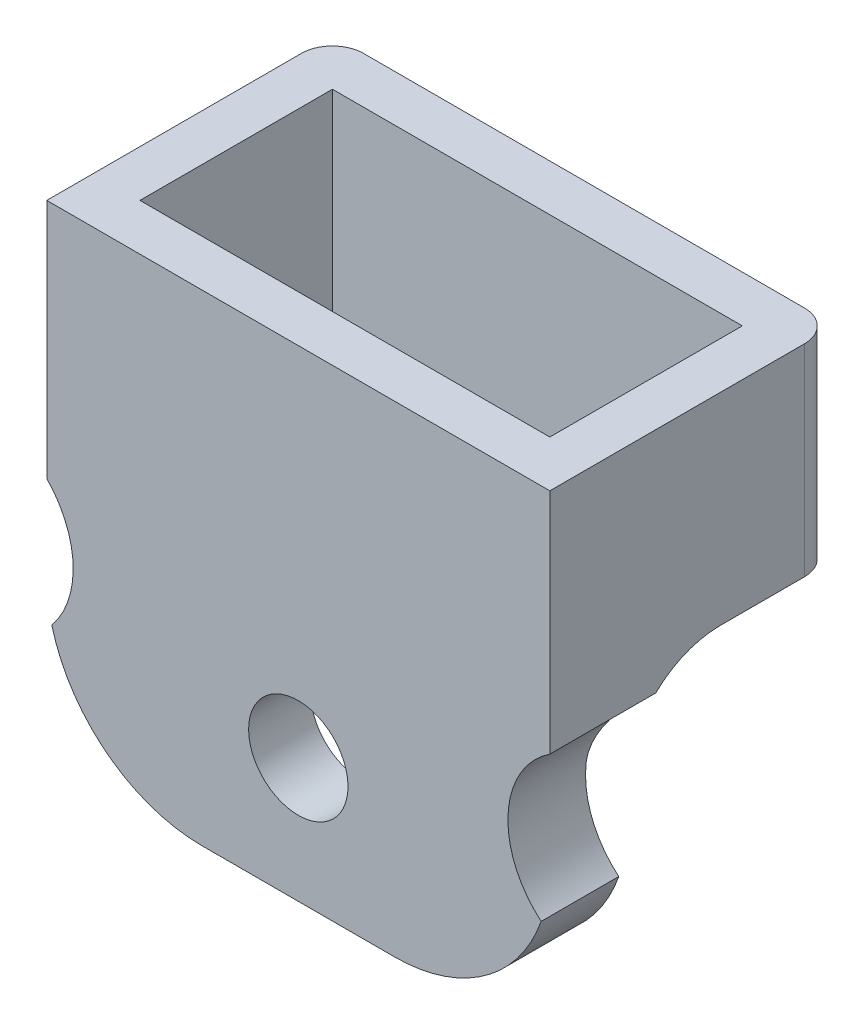
ISO-10303-21;
HEADER;
FILE_DESCRIPTION(('STEP AP214'),'2;1');
FILE_NAME('part.step','',(''),(''),'','','');
FILE_SCHEMA(('AUTOMOTIVE_DESIGN { 1 0 10303 214 1 1 1 1 }'));
ENDSEC;
DATA;
#1=APPLICATION_CONTEXT('core data for automotive mechanical design processes');
#2=APPLICATION_PROTOCOL_DEFINITION('international standard','automotive_design',2000,#1);
#3=PRODUCT_CONTEXT('',#1,'mechanical');
#4=PRODUCT('Part','Part','',(#3));
#5=PRODUCT_RELATED_PRODUCT_CATEGORY('part','',(#4));
#6=PRODUCT_DEFINITION_FORMATION('','',#4);
#7=PRODUCT_DEFINITION_CONTEXT('part definition',#1,'design');
#8=PRODUCT_DEFINITION('design','',#6,#7);
#9=PRODUCT_DEFINITION_SHAPE('','',#8);
#10=(LENGTH_UNIT() NAMED_UNIT(*) SI_UNIT(.MILLI.,.METRE.));
#11=(NAMED_UNIT(*) PLANE_ANGLE_UNIT() SI_UNIT($,.RADIAN.));
#12=(NAMED_UNIT(*) SI_UNIT($,.STERADIAN.) SOLID_ANGLE_UNIT());
#13=UNCERTAINTY_MEASURE_WITH_UNIT(LENGTH_MEASURE(1.E-05),#10,'distance_accuracy_value','');
#14=(GEOMETRIC_REPRESENTATION_CONTEXT(3) GLOBAL_UNCERTAINTY_ASSIGNED_CONTEXT((#13)) GLOBAL_UNIT_ASSIGNED_CONTEXT((#10,
#11,#12)) REPRESENTATION_CONTEXT('',''));
#15=CARTESIAN_POINT('',(0.,0.,0.));
#16=DIRECTION('',(0.,0.,1.));
#17=DIRECTION('',(1.,0.,0.));
#18=AXIS2_PLACEMENT_3D('',#15,#16,#17);
#19=CARTESIAN_POINT('',(6.6,-5.,6.0254833995939));
#20=DIRECTION('',(0.,0.,-1.));
#21=DIRECTION('',(-1.,0.,0.));
#22=AXIS2_PLACEMENT_3D('',#19,#20,#21);
#23=CYLINDRICAL_SURFACE('',#22,1.6);
#24=CARTESIAN_POINT('',(6.6,-5.,1.5));
#25=DIRECTION('',(0.,0.,-1.));
#26=DIRECTION('',(-1.,0.,0.));
#27=AXIS2_PLACEMENT_3D('',#24,#25,#26);
#28=CIRCLE('',#27,1.6);
#29=CARTESIAN_POINT('',(5.,-5.,1.5));
#30=VERTEX_POINT('',#29);
#31=EDGE_CURVE('E383',#30,#30,#28,.F.);
#32=ORIENTED_EDGE('',*,*,#31,.T.);
#33=EDGE_LOOP('',(#32));
#34=FACE_BOUND('',#33,.T.);
#35=CARTESIAN_POINT('',(6.6,-5.,-0.5));
#36=DIRECTION('',(0.,0.,-1.));
#37=DIRECTION('',(-1.,0.,0.));
#38=AXIS2_PLACEMENT_3D('',#35,#36,#37);
#39=CIRCLE('',#38,1.6);
#40=CARTESIAN_POINT('',(5.,-5.,-0.500000000000001));
#41=VERTEX_POINT('',#40);
#42=EDGE_CURVE('E37',#41,#41,#39,.F.);
#43=ORIENTED_EDGE('',*,*,#42,.F.);
#44=EDGE_LOOP('',(#43));
#45=FACE_BOUND('',#44,.T.);
#46=ADVANCED_FACE('F32',(#34,#45),#23,.F.);
#47=CARTESIAN_POINT('',(0.,6.5,0.));
#48=DIRECTION('',(0.,-1.,0.));
#49=DIRECTION('',(0.,0.,-1.));
#50=AXIS2_PLACEMENT_3D('',#47,#48,#49);
#51=PLANE('',#50);
#52=DIRECTION('',(0.,0.,-1.));
#53=VECTOR('',#52,1.);
#54=CARTESIAN_POINT('',(14.7,6.5,1.5));
#55=LINE('',#54,#53);
#56=CARTESIAN_POINT('',(14.7,6.5,1.5));
#57=VERTEX_POINT('',#56);
#58=CARTESIAN_POINT('',(14.7,6.5,-6.7));
#59=VERTEX_POINT('',#58);
#60=EDGE_CURVE('E417',#57,#59,#55,.T.);
#61=ORIENTED_EDGE('',*,*,#60,.T.);
#62=CARTESIAN_POINT('',(13.7,6.5,-6.7));
#63=DIRECTION('',(0.,-1.,0.));
#64=DIRECTION('',(0.,0.,-1.));
#65=AXIS2_PLACEMENT_3D('',#62,#63,#64);
#66=CIRCLE('',#65,1.);
#67=CARTESIAN_POINT('',(13.7,6.5,-7.7));
#68=VERTEX_POINT('',#67);
#69=EDGE_CURVE('E361',#59,#68,#66,.F.);
#70=ORIENTED_EDGE('',*,*,#69,.T.);
#71=DIRECTION('',(-1.,0.,0.));
#72=VECTOR('',#71,1.);
#73=CARTESIAN_POINT('',(-1.5,6.5,-7.7));
#74=LINE('',#73,#72);
#75=CARTESIAN_POINT('',(-0.5,6.5,-7.7));
#76=VERTEX_POINT('',#75);
#77=EDGE_CURVE('E347',#68,#76,#74,.T.);
#78=ORIENTED_EDGE('',*,*,#77,.T.);
#79=CARTESIAN_POINT('',(-0.5,6.5,-6.7));
#80=DIRECTION('',(0.,-1.,0.));
#81=DIRECTION('',(0.,0.,-1.));
#82=AXIS2_PLACEMENT_3D('',#79,#80,#81);
#83=CIRCLE('',#82,1.);
#84=CARTESIAN_POINT('',(-1.5,6.5,-6.7));
#85=VERTEX_POINT('',#84);
#86=EDGE_CURVE('E359',#76,#85,#83,.F.);
#87=ORIENTED_EDGE('',*,*,#86,.T.);
#88=DIRECTION('',(0.,0.,1.));
#89=VECTOR('',#88,1.);
#90=CARTESIAN_POINT('',(-1.5,6.5,1.5));
#91=LINE('',#90,#89);
#92=CARTESIAN_POINT('',(-1.5,6.5,1.5));
#93=VERTEX_POINT('',#92);
#94=EDGE_CURVE('E338',#85,#93,#91,.T.);
#95=ORIENTED_EDGE('',*,*,#94,.T.);
#96=DIRECTION('',(1.,0.,0.));
#97=VECTOR('',#96,1.);
#98=CARTESIAN_POINT('',(-1.5,6.5,1.5));
#99=LINE('',#98,#97);
#100=EDGE_CURVE('E415',#93,#57,#99,.T.);
#101=ORIENTED_EDGE('',*,*,#100,.T.);
#102=EDGE_LOOP('',(#61,#70,#78,#87,#95,#101));
#103=FACE_BOUND('',#102,.T.);
#104=DIRECTION('',(0.,0.,1.));
#105=VECTOR('',#104,1.);
#106=CARTESIAN_POINT('',(0.,6.5,0.));
#107=LINE('',#106,#105);
#108=CARTESIAN_POINT('',(0.,6.5,-6.2));
#109=VERTEX_POINT('',#108);
#110=CARTESIAN_POINT('',(0.,6.5,0.));
#111=VERTEX_POINT('',#110);
#112=EDGE_CURVE('E384',#109,#111,#107,.T.);
#113=ORIENTED_EDGE('',*,*,#112,.F.);
#114=DIRECTION('',(-1.,0.,0.));
#115=VECTOR('',#114,1.);
#116=CARTESIAN_POINT('',(0.,6.5,-6.2));
#117=LINE('',#116,#115);
#118=CARTESIAN_POINT('',(13.2,6.5,-6.2));
#119=VERTEX_POINT('',#118);
#120=EDGE_CURVE('E392',#119,#109,#117,.T.);
#121=ORIENTED_EDGE('',*,*,#120,.F.);
#122=DIRECTION('',(0.,0.,-1.));
#123=VECTOR('',#122,1.);
#124=CARTESIAN_POINT('',(13.2,6.5,0.));
#125=LINE('',#124,#123);
#126=CARTESIAN_POINT('',(13.2,6.5,0.));
#127=VERTEX_POINT('',#126);
#128=EDGE_CURVE('E389',#127,#119,#125,.T.);
#129=ORIENTED_EDGE('',*,*,#128,.F.);
#130=DIRECTION('',(1.,0.,0.));
#131=VECTOR('',#130,1.);
#132=CARTESIAN_POINT('',(0.,6.5,0.));
#133=LINE('',#132,#131);
#134=EDGE_CURVE('E386',#111,#127,#133,.T.);
#135=ORIENTED_EDGE('',*,*,#134,.F.);
#136=EDGE_LOOP('',(#113,#121,#129,#135));
#137=FACE_BOUND('',#136,.T.);
#138=ADVANCED_FACE('F247',(#103,#137),#51,.F.);
#139=CARTESIAN_POINT('',(0.,0.,0.));
#140=DIRECTION('',(0.,-1.,0.));
#141=DIRECTION('',(0.,0.,-1.));
#142=AXIS2_PLACEMENT_3D('',#139,#140,#141);
#143=PLANE('',#142);
#144=DIRECTION('',(0.,0.,-1.));
#145=VECTOR('',#144,1.);
#146=CARTESIAN_POINT('',(14.7,0.,1.5));
#147=LINE('',#146,#145);
#148=CARTESIAN_POINT('',(14.7,0.,-4.));
#149=VERTEX_POINT('',#148);
#150=CARTESIAN_POINT('',(14.7,0.,-6.7));
#151=VERTEX_POINT('',#150);
#152=EDGE_CURVE('E327',#149,#151,#147,.T.);
#153=ORIENTED_EDGE('',*,*,#152,.F.);
#154=DIRECTION('',(1.,0.,0.));
#155=VECTOR('',#154,1.);
#156=CARTESIAN_POINT('',(0.,0.,-4.));
#157=LINE('',#156,#155);
#158=CARTESIAN_POINT('',(13.2,0.,-4.));
#159=VERTEX_POINT('',#158);
#160=EDGE_CURVE('E218',#149,#159,#157,.F.);
#161=ORIENTED_EDGE('',*,*,#160,.T.);
#162=DIRECTION('',(0.,0.,-1.));
#163=VECTOR('',#162,1.);
#164=CARTESIAN_POINT('',(13.2,0.,0.));
#165=LINE('',#164,#163);
#166=CARTESIAN_POINT('',(13.2,0.,-6.2));
#167=VERTEX_POINT('',#166);
#168=EDGE_CURVE('E399',#159,#167,#165,.T.);
#169=ORIENTED_EDGE('',*,*,#168,.T.);
#170=DIRECTION('',(-1.,0.,0.));
#171=VECTOR('',#170,1.);
#172=CARTESIAN_POINT('',(0.,0.,-6.2));
#173=LINE('',#172,#171);
#174=CARTESIAN_POINT('',(0.,0.,-6.2));
#175=VERTEX_POINT('',#174);
#176=EDGE_CURVE('E387',#167,#175,#173,.T.);
#177=ORIENTED_EDGE('',*,*,#176,.T.);
#178=DIRECTION('',(0.,0.,1.));
#179=VECTOR('',#178,1.);
#180=CARTESIAN_POINT('',(0.,0.,0.));
#181=LINE('',#180,#179);
#182=CARTESIAN_POINT('',(0.,0.,-4.));
#183=VERTEX_POINT('',#182);
#184=EDGE_CURVE('E375',#175,#183,#181,.T.);
#185=ORIENTED_EDGE('',*,*,#184,.T.);
#186=DIRECTION('',(1.,0.,0.));
#187=VECTOR('',#186,1.);
#188=CARTESIAN_POINT('',(0.,0.,-4.));
#189=LINE('',#188,#187);
#190=CARTESIAN_POINT('',(-1.5,0.,-4.));
#191=VERTEX_POINT('',#190);
#192=EDGE_CURVE('E216',#183,#191,#189,.F.);
#193=ORIENTED_EDGE('',*,*,#192,.T.);
#194=DIRECTION('',(0.,0.,1.));
#195=VECTOR('',#194,1.);
#196=CARTESIAN_POINT('',(-1.5,0.,1.5));
#197=LINE('',#196,#195);
#198=CARTESIAN_POINT('',(-1.5,0.,-6.7));
#199=VERTEX_POINT('',#198);
#200=EDGE_CURVE('E335',#199,#191,#197,.T.);
#201=ORIENTED_EDGE('',*,*,#200,.F.);
#202=CARTESIAN_POINT('',(-0.5,0.,-6.7));
#203=DIRECTION('',(0.,-1.,0.));
#204=DIRECTION('',(0.,0.,-1.));
#205=AXIS2_PLACEMENT_3D('',#202,#203,#204);
#206=CIRCLE('',#205,1.);
#207=CARTESIAN_POINT('',(-0.5,0.,-7.7));
#208=VERTEX_POINT('',#207);
#209=EDGE_CURVE('E354',#199,#208,#206,.T.);
#210=ORIENTED_EDGE('',*,*,#209,.T.);
#211=DIRECTION('',(-1.,0.,0.));
#212=VECTOR('',#211,1.);
#213=CARTESIAN_POINT('',(-1.5,0.,-7.7));
#214=LINE('',#213,#212);
#215=CARTESIAN_POINT('',(13.7,0.,-7.7));
#216=VERTEX_POINT('',#215);
#217=EDGE_CURVE('E334',#216,#208,#214,.T.);
#218=ORIENTED_EDGE('',*,*,#217,.F.);
#219=CARTESIAN_POINT('',(13.7,0.,-6.7));
#220=DIRECTION('',(0.,-1.,0.));
#221=DIRECTION('',(0.,0.,-1.));
#222=AXIS2_PLACEMENT_3D('',#219,#220,#221);
#223=CIRCLE('',#222,1.);
#224=EDGE_CURVE('E332',#216,#151,#223,.T.);
#225=ORIENTED_EDGE('',*,*,#224,.T.);
#226=EDGE_LOOP('',(#153,#161,#169,#177,#185,#193,#201,#210,#218,#225));
#227=FACE_BOUND('',#226,.T.);
#228=ADVANCED_FACE('F281',(#227),#143,.T.);
#229=CARTESIAN_POINT('',(-1.5,6.5,1.5));
#230=DIRECTION('',(1.,0.,0.));
#231=DIRECTION('',(0.,0.,-1.));
#232=AXIS2_PLACEMENT_3D('',#229,#230,#231);
#233=PLANE('',#232);
#234=CARTESIAN_POINT('',(-1.5,-3.,-4.));
#235=DIRECTION('',(1.,0.,0.));
#236=DIRECTION('',(0.,0.,-1.));
#237=AXIS2_PLACEMENT_3D('',#234,#235,#236);
#238=CIRCLE('',#237,3.);
#239=CARTESIAN_POINT('',(-1.5,-1.25775240470923,-1.55775240470924));
#240=VERTEX_POINT('',#239);
#241=EDGE_CURVE('E226',#191,#240,#238,.T.);
#242=ORIENTED_EDGE('',*,*,#241,.T.);
#243=DIRECTION('',(0.,0.,-1.));
#244=VECTOR('',#243,1.);
#245=CARTESIAN_POINT('',(-1.5,-1.25775240470923,9.98528137423856));
#246=LINE('',#245,#244);
#247=CARTESIAN_POINT('',(-1.5,-1.25775240470923,1.5));
#248=VERTEX_POINT('',#247);
#249=EDGE_CURVE('E56',#240,#248,#246,.F.);
#250=ORIENTED_EDGE('',*,*,#249,.T.);
#251=DIRECTION('',(0.,-1.,0.));
#252=VECTOR('',#251,1.);
#253=CARTESIAN_POINT('',(-1.5,6.5,1.5));
#254=LINE('',#253,#252);
#255=EDGE_CURVE('E187',#93,#248,#254,.T.);
#256=ORIENTED_EDGE('',*,*,#255,.F.);
#257=ORIENTED_EDGE('',*,*,#94,.F.);
#258=DIRECTION('',(0.,-1.,0.));
#259=VECTOR('',#258,1.);
#260=CARTESIAN_POINT('',(-1.5,6.5,-6.7));
#261=LINE('',#260,#259);
#262=EDGE_CURVE('E363',#85,#199,#261,.T.);
#263=ORIENTED_EDGE('',*,*,#262,.T.);
#264=ORIENTED_EDGE('',*,*,#200,.T.);
#265=EDGE_LOOP('',(#242,#250,#256,#257,#263,#264));
#266=FACE_BOUND('',#265,.T.);
#267=ADVANCED_FACE('F285',(#266),#233,.F.);
#268=CARTESIAN_POINT('',(-1.5,6.5,1.5));
#269=DIRECTION('',(0.,0.,-1.));
#270=DIRECTION('',(-1.,0.,0.));
#271=AXIS2_PLACEMENT_3D('',#268,#269,#270);
#272=PLANE('',#271);
#273=ORIENTED_EDGE('',*,*,#31,.F.);
#274=EDGE_LOOP('',(#273));
#275=FACE_BOUND('',#274,.T.);
#276=CARTESIAN_POINT('',(9.7,-4.,1.5));
#277=DIRECTION('',(0.,0.,-1.));
#278=DIRECTION('',(-1.,0.,0.));
#279=AXIS2_PLACEMENT_3D('',#276,#277,#278);
#280=CIRCLE('',#279,5.);
#281=CARTESIAN_POINT('',(9.7,-9.,1.5));
#282=VERTEX_POINT('',#281);
#283=CARTESIAN_POINT('',(14.4208016201586,-5.64743196008444,1.5));
#284=VERTEX_POINT('',#283);
#285=EDGE_CURVE('E194',#282,#284,#280,.F.);
#286=ORIENTED_EDGE('',*,*,#285,.T.);
#287=CARTESIAN_POINT('',(16.35,-3.35,1.5));
#288=DIRECTION('',(0.,0.,-1.));
#289=DIRECTION('',(-1.,0.,0.));
#290=AXIS2_PLACEMENT_3D('',#287,#288,#289);
#291=CIRCLE('',#290,3.);
#292=CARTESIAN_POINT('',(14.7,-0.844506036726491,1.5));
#293=VERTEX_POINT('',#292);
#294=EDGE_CURVE('E188',#293,#284,#291,.F.);
#295=ORIENTED_EDGE('',*,*,#294,.F.);
#296=DIRECTION('',(0.,-1.,0.));
#297=VECTOR('',#296,1.);
#298=CARTESIAN_POINT('',(14.7,6.5,1.5));
#299=LINE('',#298,#297);
#300=EDGE_CURVE('E345',#57,#293,#299,.T.);
#301=ORIENTED_EDGE('',*,*,#300,.F.);
#302=ORIENTED_EDGE('',*,*,#100,.F.);
#303=ORIENTED_EDGE('',*,*,#255,.T.);
#304=CARTESIAN_POINT('',(-3.65,-3.35,1.5));
#305=DIRECTION('',(0.,0.,-1.));
#306=DIRECTION('',(-1.,0.,0.));
#307=AXIS2_PLACEMENT_3D('',#304,#305,#306);
#308=CIRCLE('',#307,3.);
#309=CARTESIAN_POINT('',(-1.33814378610297,-5.26188933944036,1.5));
#310=VERTEX_POINT('',#309);
#311=EDGE_CURVE('E171',#310,#248,#308,.F.);
#312=ORIENTED_EDGE('',*,*,#311,.F.);
#313=CARTESIAN_POINT('',(3.5,-4.,1.5));
#314=DIRECTION('',(0.,0.,-1.));
#315=DIRECTION('',(-1.,0.,0.));
#316=AXIS2_PLACEMENT_3D('',#313,#314,#315);
#317=CIRCLE('',#316,5.);
#318=CARTESIAN_POINT('',(3.5,-9.,1.5));
#319=VERTEX_POINT('',#318);
#320=EDGE_CURVE('E183',#310,#319,#317,.F.);
#321=ORIENTED_EDGE('',*,*,#320,.T.);
#322=DIRECTION('',(-1.,0.,0.));
#323=VECTOR('',#322,1.);
#324=CARTESIAN_POINT('',(14.7,-9.,1.5));
#325=LINE('',#324,#323);
#326=EDGE_CURVE('E369',#282,#319,#325,.T.);
#327=ORIENTED_EDGE('',*,*,#326,.F.);
#328=EDGE_LOOP('',(#286,#295,#301,#302,#303,#312,#321,#327));
#329=FACE_BOUND('',#328,.T.);
#330=ADVANCED_FACE('F181',(#275,#329),#272,.F.);
#331=CARTESIAN_POINT('',(14.7,6.5,1.5));
#332=DIRECTION('',(-1.,0.,0.));
#333=DIRECTION('',(0.,0.,1.));
#334=AXIS2_PLACEMENT_3D('',#331,#332,#333);
#335=PLANE('',#334);
#336=ORIENTED_EDGE('',*,*,#300,.T.);
#337=DIRECTION('',(0.,0.,-1.));
#338=VECTOR('',#337,1.);
#339=CARTESIAN_POINT('',(14.7,-0.844506036726492,9.98528137423856));
#340=LINE('',#339,#338);
#341=CARTESIAN_POINT('',(14.7,-0.844506036726492,-1.9134128884009));
#342=VERTEX_POINT('',#341);
#343=EDGE_CURVE('E329',#293,#342,#340,.T.);
#344=ORIENTED_EDGE('',*,*,#343,.T.);
#345=CARTESIAN_POINT('',(14.7,-3.,-4.));
#346=DIRECTION('',(-1.,0.,0.));
#347=DIRECTION('',(0.,0.,1.));
#348=AXIS2_PLACEMENT_3D('',#345,#346,#347);
#349=CIRCLE('',#348,3.);
#350=EDGE_CURVE('E220',#342,#149,#349,.T.);
#351=ORIENTED_EDGE('',*,*,#350,.T.);
#352=ORIENTED_EDGE('',*,*,#152,.T.);
#353=DIRECTION('',(0.,-1.,0.));
#354=VECTOR('',#353,1.);
#355=CARTESIAN_POINT('',(14.7,6.5,-6.7));
#356=LINE('',#355,#354);
#357=EDGE_CURVE('E357',#151,#59,#356,.F.);
#358=ORIENTED_EDGE('',*,*,#357,.T.);
#359=ORIENTED_EDGE('',*,*,#60,.F.);
#360=EDGE_LOOP('',(#336,#344,#351,#352,#358,#359));
#361=FACE_BOUND('',#360,.T.);
#362=ADVANCED_FACE('F289',(#361),#335,.F.);
#363=CARTESIAN_POINT('',(-1.5,6.5,-7.7));
#364=DIRECTION('',(0.,0.,1.));
#365=DIRECTION('',(1.,0.,0.));
#366=AXIS2_PLACEMENT_3D('',#363,#364,#365);
#367=PLANE('',#366);
#368=ORIENTED_EDGE('',*,*,#77,.F.);
#369=DIRECTION('',(0.,-1.,0.));
#370=VECTOR('',#369,1.);
#371=CARTESIAN_POINT('',(13.7,6.5,-7.7));
#372=LINE('',#371,#370);
#373=EDGE_CURVE('E351',#68,#216,#372,.T.);
#374=ORIENTED_EDGE('',*,*,#373,.T.);
#375=ORIENTED_EDGE('',*,*,#217,.T.);
#376=DIRECTION('',(0.,-1.,0.));
#377=VECTOR('',#376,1.);
#378=CARTESIAN_POINT('',(-0.5,6.5,-7.7));
#379=LINE('',#378,#377);
#380=EDGE_CURVE('E349',#208,#76,#379,.F.);
#381=ORIENTED_EDGE('',*,*,#380,.T.);
#382=EDGE_LOOP('',(#368,#374,#375,#381));
#383=FACE_BOUND('',#382,.T.);
#384=ADVANCED_FACE('F277',(#383),#367,.F.);
#385=CARTESIAN_POINT('',(0.,6.5,0.));
#386=DIRECTION('',(1.,0.,0.));
#387=DIRECTION('',(0.,0.,-1.));
#388=AXIS2_PLACEMENT_3D('',#385,#386,#387);
#389=PLANE('',#388);
#390=ORIENTED_EDGE('',*,*,#184,.F.);
#391=DIRECTION('',(0.,-1.,0.));
#392=VECTOR('',#391,1.);
#393=CARTESIAN_POINT('',(0.,6.5,-6.2));
#394=LINE('',#393,#392);
#395=EDGE_CURVE('E393',#109,#175,#394,.T.);
#396=ORIENTED_EDGE('',*,*,#395,.F.);
#397=ORIENTED_EDGE('',*,*,#112,.T.);
#398=DIRECTION('',(0.,-1.,0.));
#399=VECTOR('',#398,1.);
#400=CARTESIAN_POINT('',(0.,6.5,0.));
#401=LINE('',#400,#399);
#402=CARTESIAN_POINT('',(0.,0.,0.));
#403=VERTEX_POINT('',#402);
#404=EDGE_CURVE('E341',#111,#403,#401,.T.);
#405=ORIENTED_EDGE('',*,*,#404,.T.);
#406=CARTESIAN_POINT('',(0.,0.,-1.));
#407=VERTEX_POINT('',#406);
#408=EDGE_CURVE('E372',#407,#403,#181,.T.);
#409=ORIENTED_EDGE('',*,*,#408,.F.);
#410=DIRECTION('',(0.,1.,0.));
#411=VECTOR('',#410,1.);
#412=CARTESIAN_POINT('',(0.,-9.,-1.));
#413=LINE('',#412,#411);
#414=CARTESIAN_POINT('',(0.,-3.,-1.));
#415=VERTEX_POINT('',#414);
#416=EDGE_CURVE('E206',#415,#407,#413,.T.);
#417=ORIENTED_EDGE('',*,*,#416,.F.);
#418=CARTESIAN_POINT('',(0.,-3.,-4.));
#419=DIRECTION('',(1.,0.,0.));
#420=DIRECTION('',(0.,0.,-1.));
#421=AXIS2_PLACEMENT_3D('',#418,#419,#420);
#422=CIRCLE('',#421,3.);
#423=EDGE_CURVE('E224',#415,#183,#422,.F.);
#424=ORIENTED_EDGE('',*,*,#423,.T.);
#425=EDGE_LOOP('',(#390,#396,#397,#405,#409,#417,#424));
#426=FACE_BOUND('',#425,.T.);
#427=ADVANCED_FACE('F273',(#426),#389,.T.);
#428=CARTESIAN_POINT('',(0.,6.5,0.));
#429=DIRECTION('',(0.,0.,-1.));
#430=DIRECTION('',(-1.,0.,0.));
#431=AXIS2_PLACEMENT_3D('',#428,#429,#430);
#432=PLANE('',#431);
#433=DIRECTION('',(1.,0.,0.));
#434=VECTOR('',#433,1.);
#435=CARTESIAN_POINT('',(0.,0.,0.));
#436=LINE('',#435,#434);
#437=CARTESIAN_POINT('',(13.2,0.,0.));
#438=VERTEX_POINT('',#437);
#439=EDGE_CURVE('E396',#403,#438,#436,.T.);
#440=ORIENTED_EDGE('',*,*,#439,.F.);
#441=ORIENTED_EDGE('',*,*,#404,.F.);
#442=ORIENTED_EDGE('',*,*,#134,.T.);
#443=DIRECTION('',(0.,-1.,0.));
#444=VECTOR('',#443,1.);
#445=CARTESIAN_POINT('',(13.2,6.5,0.));
#446=LINE('',#445,#444);
#447=EDGE_CURVE('E410',#127,#438,#446,.T.);
#448=ORIENTED_EDGE('',*,*,#447,.T.);
#449=EDGE_LOOP('',(#440,#441,#442,#448));
#450=FACE_BOUND('',#449,.T.);
#451=ADVANCED_FACE('F269',(#450),#432,.T.);
#452=CARTESIAN_POINT('',(13.2,6.5,0.));
#453=DIRECTION('',(-1.,0.,0.));
#454=DIRECTION('',(0.,0.,1.));
#455=AXIS2_PLACEMENT_3D('',#452,#453,#454);
#456=PLANE('',#455);
#457=CARTESIAN_POINT('',(13.2,0.,-1.));
#458=VERTEX_POINT('',#457);
#459=EDGE_CURVE('E400',#438,#458,#165,.T.);
#460=ORIENTED_EDGE('',*,*,#459,.F.);
#461=ORIENTED_EDGE('',*,*,#447,.F.);
#462=ORIENTED_EDGE('',*,*,#128,.T.);
#463=DIRECTION('',(0.,-1.,0.));
#464=VECTOR('',#463,1.);
#465=CARTESIAN_POINT('',(13.2,6.5,-6.2));
#466=LINE('',#465,#464);
#467=EDGE_CURVE('E407',#119,#167,#466,.T.);
#468=ORIENTED_EDGE('',*,*,#467,.T.);
#469=ORIENTED_EDGE('',*,*,#168,.F.);
#470=CARTESIAN_POINT('',(13.2,-3.,-4.));
#471=DIRECTION('',(-1.,0.,0.));
#472=DIRECTION('',(0.,0.,1.));
#473=AXIS2_PLACEMENT_3D('',#470,#471,#472);
#474=CIRCLE('',#473,3.);
#475=CARTESIAN_POINT('',(13.2,-3.,-1.));
#476=VERTEX_POINT('',#475);
#477=EDGE_CURVE('E222',#159,#476,#474,.F.);
#478=ORIENTED_EDGE('',*,*,#477,.T.);
#479=DIRECTION('',(0.,-1.,0.));
#480=VECTOR('',#479,1.);
#481=CARTESIAN_POINT('',(13.2,-9.,-1.));
#482=LINE('',#481,#480);
#483=EDGE_CURVE('E210',#458,#476,#482,.T.);
#484=ORIENTED_EDGE('',*,*,#483,.F.);
#485=EDGE_LOOP('',(#460,#461,#462,#468,#469,#478,#484));
#486=FACE_BOUND('',#485,.T.);
#487=ADVANCED_FACE('F265',(#486),#456,.T.);
#488=CARTESIAN_POINT('',(0.,6.5,-6.2));
#489=DIRECTION('',(0.,0.,1.));
#490=DIRECTION('',(1.,0.,0.));
#491=AXIS2_PLACEMENT_3D('',#488,#489,#490);
#492=PLANE('',#491);
#493=ORIENTED_EDGE('',*,*,#176,.F.);
#494=ORIENTED_EDGE('',*,*,#467,.F.);
#495=ORIENTED_EDGE('',*,*,#120,.T.);
#496=ORIENTED_EDGE('',*,*,#395,.T.);
#497=EDGE_LOOP('',(#493,#494,#495,#496));
#498=FACE_BOUND('',#497,.T.);
#499=ADVANCED_FACE('F261',(#498),#492,.T.);
#500=CARTESIAN_POINT('',(14.7,-9.,-1.));
#501=DIRECTION('',(0.,0.,1.));
#502=DIRECTION('',(1.,0.,0.));
#503=AXIS2_PLACEMENT_3D('',#500,#501,#502);
#504=PLANE('',#503);
#505=CARTESIAN_POINT('',(6.6,-5.,-1.));
#506=DIRECTION('',(0.,0.,-1.));
#507=DIRECTION('',(-1.,0.,0.));
#508=AXIS2_PLACEMENT_3D('',#505,#506,#507);
#509=CIRCLE('',#508,2.9);
#510=CARTESIAN_POINT('',(3.7,-5.,-1.));
#511=VERTEX_POINT('',#510);
#512=EDGE_CURVE('E448',#511,#511,#509,.T.);
#513=ORIENTED_EDGE('',*,*,#512,.F.);
#514=EDGE_LOOP('',(#513));
#515=FACE_BOUND('',#514,.T.);
#516=DIRECTION('',(1.,0.,0.));
#517=VECTOR('',#516,1.);
#518=CARTESIAN_POINT('',(14.7,-3.,-1.));
#519=LINE('',#518,#517);
#520=CARTESIAN_POINT('',(13.3704866169121,-3.,-1.));
#521=VERTEX_POINT('',#520);
#522=EDGE_CURVE('E213',#476,#521,#519,.T.);
#523=ORIENTED_EDGE('',*,*,#522,.T.);
#524=CARTESIAN_POINT('',(16.35,-3.35,-0.999999999999999));
#525=DIRECTION('',(0.,0.,1.));
#526=DIRECTION('',(1.,0.,0.));
#527=AXIS2_PLACEMENT_3D('',#524,#525,#526);
#528=CIRCLE('',#527,3.);
#529=CARTESIAN_POINT('',(14.4208016201586,-5.64743196008444,-1.));
#530=VERTEX_POINT('',#529);
#531=EDGE_CURVE('E49',#521,#530,#528,.T.);
#532=ORIENTED_EDGE('',*,*,#531,.T.);
#533=CARTESIAN_POINT('',(9.7,-4.,-1.));
#534=DIRECTION('',(0.,0.,1.));
#535=DIRECTION('',(1.,0.,0.));
#536=AXIS2_PLACEMENT_3D('',#533,#534,#535);
#537=CIRCLE('',#536,5.);
#538=CARTESIAN_POINT('',(9.7,-9.,-1.));
#539=VERTEX_POINT('',#538);
#540=EDGE_CURVE('E204',#530,#539,#537,.F.);
#541=ORIENTED_EDGE('',*,*,#540,.T.);
#542=DIRECTION('',(1.,0.,0.));
#543=VECTOR('',#542,1.);
#544=CARTESIAN_POINT('',(14.7,-9.,-1.));
#545=LINE('',#544,#543);
#546=CARTESIAN_POINT('',(3.5,-9.,-1.));
#547=VERTEX_POINT('',#546);
#548=EDGE_CURVE('E367',#547,#539,#545,.T.);
#549=ORIENTED_EDGE('',*,*,#548,.F.);
#550=CARTESIAN_POINT('',(3.5,-4.,-1.));
#551=DIRECTION('',(0.,0.,1.));
#552=DIRECTION('',(1.,0.,0.));
#553=AXIS2_PLACEMENT_3D('',#550,#551,#552);
#554=CIRCLE('',#553,5.);
#555=CARTESIAN_POINT('',(-1.33814378610297,-5.26188933944036,-1.));
#556=VERTEX_POINT('',#555);
#557=EDGE_CURVE('E197',#547,#556,#554,.F.);
#558=ORIENTED_EDGE('',*,*,#557,.T.);
#559=CARTESIAN_POINT('',(-3.65,-3.35,-1.));
#560=DIRECTION('',(0.,0.,1.));
#561=DIRECTION('',(1.,0.,0.));
#562=AXIS2_PLACEMENT_3D('',#559,#560,#561);
#563=CIRCLE('',#562,3.);
#564=CARTESIAN_POINT('',(-0.670486616912082,-3.,-1.));
#565=VERTEX_POINT('',#564);
#566=EDGE_CURVE('E173',#556,#565,#563,.T.);
#567=ORIENTED_EDGE('',*,*,#566,.T.);
#568=DIRECTION('',(1.,0.,0.));
#569=VECTOR('',#568,1.);
#570=CARTESIAN_POINT('',(14.7,-3.,-1.));
#571=LINE('',#570,#569);
#572=EDGE_CURVE('E208',#565,#415,#571,.T.);
#573=ORIENTED_EDGE('',*,*,#572,.T.);
#574=ORIENTED_EDGE('',*,*,#416,.T.);
#575=DIRECTION('',(1.,0.,0.));
#576=VECTOR('',#575,1.);
#577=CARTESIAN_POINT('',(14.7,0.,-1.));
#578=LINE('',#577,#576);
#579=EDGE_CURVE('E377',#407,#458,#578,.T.);
#580=ORIENTED_EDGE('',*,*,#579,.T.);
#581=ORIENTED_EDGE('',*,*,#483,.T.);
#582=EDGE_LOOP('',(#523,#532,#541,#549,#558,#567,#573,#574,#580,#581));
#583=FACE_BOUND('',#582,.T.);
#584=ADVANCED_FACE('F253',(#515,#583),#504,.F.);
#585=CARTESIAN_POINT('',(0.,-9.,0.));
#586=DIRECTION('',(0.,1.,0.));
#587=DIRECTION('',(0.,0.,1.));
#588=AXIS2_PLACEMENT_3D('',#585,#586,#587);
#589=PLANE('',#588);
#590=ORIENTED_EDGE('',*,*,#548,.T.);
#591=DIRECTION('',(0.,0.,1.));
#592=VECTOR('',#591,1.);
#593=CARTESIAN_POINT('',(9.7,-9.,0.));
#594=LINE('',#593,#592);
#595=EDGE_CURVE('E195',#539,#282,#594,.T.);
#596=ORIENTED_EDGE('',*,*,#595,.T.);
#597=ORIENTED_EDGE('',*,*,#326,.T.);
#598=DIRECTION('',(0.,0.,-1.));
#599=VECTOR('',#598,1.);
#600=CARTESIAN_POINT('',(3.5,-9.,0.));
#601=LINE('',#600,#599);
#602=EDGE_CURVE('E193',#319,#547,#601,.T.);
#603=ORIENTED_EDGE('',*,*,#602,.T.);
#604=EDGE_LOOP('',(#590,#596,#597,#603));
#605=FACE_BOUND('',#604,.T.);
#606=ADVANCED_FACE('F249',(#605),#589,.F.);
#607=CARTESIAN_POINT('',(0.,0.,0.));
#608=DIRECTION('',(0.,1.,0.));
#609=DIRECTION('',(0.,0.,1.));
#610=AXIS2_PLACEMENT_3D('',#607,#608,#609);
#611=PLANE('',#610);
#612=ORIENTED_EDGE('',*,*,#579,.F.);
#613=ORIENTED_EDGE('',*,*,#408,.T.);
#614=ORIENTED_EDGE('',*,*,#439,.T.);
#615=ORIENTED_EDGE('',*,*,#459,.T.);
#616=EDGE_LOOP('',(#612,#613,#614,#615));
#617=FACE_BOUND('',#616,.T.);
#618=ADVANCED_FACE('F252',(#617),#611,.T.);
#619=CARTESIAN_POINT('',(13.7,6.5,-6.7));
#620=DIRECTION('',(0.,-1.,0.));
#621=DIRECTION('',(0.,0.,-1.));
#622=AXIS2_PLACEMENT_3D('',#619,#620,#621);
#623=CYLINDRICAL_SURFACE('',#622,1.);
#624=ORIENTED_EDGE('',*,*,#69,.F.);
#625=ORIENTED_EDGE('',*,*,#357,.F.);
#626=ORIENTED_EDGE('',*,*,#224,.F.);
#627=ORIENTED_EDGE('',*,*,#373,.F.);
#628=EDGE_LOOP('',(#624,#625,#626,#627));
#629=FACE_BOUND('',#628,.T.);
#630=ADVANCED_FACE('F257',(#629),#623,.T.);
#631=CARTESIAN_POINT('',(-0.5,6.5,-6.7));
#632=DIRECTION('',(0.,-1.,0.));
#633=DIRECTION('',(0.,0.,-1.));
#634=AXIS2_PLACEMENT_3D('',#631,#632,#633);
#635=CYLINDRICAL_SURFACE('',#634,1.);
#636=ORIENTED_EDGE('',*,*,#86,.F.);
#637=ORIENTED_EDGE('',*,*,#380,.F.);
#638=ORIENTED_EDGE('',*,*,#209,.F.);
#639=ORIENTED_EDGE('',*,*,#262,.F.);
#640=EDGE_LOOP('',(#636,#637,#638,#639));
#641=FACE_BOUND('',#640,.T.);
#642=ADVANCED_FACE('F302',(#641),#635,.T.);
#643=CARTESIAN_POINT('',(9.7,-4.,0.));
#644=DIRECTION('',(0.,0.,1.));
#645=DIRECTION('',(1.,0.,0.));
#646=AXIS2_PLACEMENT_3D('',#643,#644,#645);
#647=CYLINDRICAL_SURFACE('',#646,5.);
#648=DIRECTION('',(0.,0.,-1.));
#649=VECTOR('',#648,1.);
#650=CARTESIAN_POINT('',(14.4208016201586,-5.64743196008444,-3.1));
#651=LINE('',#650,#649);
#652=EDGE_CURVE('E439',#284,#530,#651,.T.);
#653=ORIENTED_EDGE('',*,*,#652,.F.);
#654=ORIENTED_EDGE('',*,*,#285,.F.);
#655=ORIENTED_EDGE('',*,*,#595,.F.);
#656=ORIENTED_EDGE('',*,*,#540,.F.);
#657=EDGE_LOOP('',(#653,#654,#655,#656));
#658=FACE_BOUND('',#657,.T.);
#659=ADVANCED_FACE('F306',(#658),#647,.T.);
#660=CARTESIAN_POINT('',(3.5,-4.,0.));
#661=DIRECTION('',(0.,0.,-1.));
#662=DIRECTION('',(-1.,0.,0.));
#663=AXIS2_PLACEMENT_3D('',#660,#661,#662);
#664=CYLINDRICAL_SURFACE('',#663,5.);
#665=DIRECTION('',(0.,0.,-1.));
#666=VECTOR('',#665,1.);
#667=CARTESIAN_POINT('',(-1.33814378610297,-5.26188933944036,-3.1));
#668=LINE('',#667,#666);
#669=EDGE_CURVE('E168',#556,#310,#668,.F.);
#670=ORIENTED_EDGE('',*,*,#669,.F.);
#671=ORIENTED_EDGE('',*,*,#557,.F.);
#672=ORIENTED_EDGE('',*,*,#602,.F.);
#673=ORIENTED_EDGE('',*,*,#320,.F.);
#674=EDGE_LOOP('',(#670,#671,#672,#673));
#675=FACE_BOUND('',#674,.T.);
#676=ADVANCED_FACE('F191',(#675),#664,.T.);
#677=CARTESIAN_POINT('',(14.7,-3.,-4.));
#678=DIRECTION('',(1.,0.,0.));
#679=DIRECTION('',(0.,0.,-1.));
#680=AXIS2_PLACEMENT_3D('',#677,#678,#679);
#681=CYLINDRICAL_SURFACE('',#680,3.);
#682=ORIENTED_EDGE('',*,*,#350,.F.);
#683=CARTESIAN_POINT('',(14.7,-0.844506036726492,-1.9134128884009));
#684=CARTESIAN_POINT('',(14.6307029323582,-0.890166082235729,-1.86623362857234));
#685=CARTESIAN_POINT('',(14.563196235106,-0.938723411496488,-1.81918323954056));
#686=CARTESIAN_POINT('',(14.4318749307781,-1.04179542484272,-1.72618196625273));
#687=CARTESIAN_POINT('',(14.3680660861121,-1.09631904366954,-1.68023286018461));
#688=CARTESIAN_POINT('',(14.2436762700684,-1.21208098885796,-1.58985269720284));
#689=CARTESIAN_POINT('',(14.1831467766081,-1.27339600896729,-1.54544843710034));
#690=CARTESIAN_POINT('',(14.0666970470429,-1.40216489898054,-1.45974378601897));
#691=CARTESIAN_POINT('',(14.0107738878099,-1.46961481765494,-1.4184414280991));
#692=CARTESIAN_POINT('',(13.8755996183997,-1.64831585831422,-1.31890460106586));
#693=CARTESIAN_POINT('',(13.7997890471905,-1.76376116477222,-1.26336929083983));
#694=CARTESIAN_POINT('',(13.6634940749413,-2.00762166935048,-1.16587964582971));
#695=CARTESIAN_POINT('',(13.6029002065841,-2.13593435655528,-1.12382766875452));
#696=CARTESIAN_POINT('',(13.5291355267091,-2.32700570633802,-1.07586106427693));
#697=CARTESIAN_POINT('',(13.508653758172,-2.3853176945931,-1.06302897123164));
#698=CARTESIAN_POINT('',(13.4711816147198,-2.50368350858859,-1.04072801506216));
#699=CARTESIAN_POINT('',(13.4541903443494,-2.5637368830696,-1.03125828889824));
#700=CARTESIAN_POINT('',(13.4237374811358,-2.68592659266635,-1.01584363329271));
#701=CARTESIAN_POINT('',(13.4103188327946,-2.74807895871809,-1.00994059268006));
#702=CARTESIAN_POINT('',(13.3874107671047,-2.87340161087214,-1.00201105431046));
#703=CARTESIAN_POINT('',(13.3779247868564,-2.93657273748089,-0.999987941984985));
#704=CARTESIAN_POINT('',(13.3704866169121,-3.,-1.));
#705=B_SPLINE_CURVE_WITH_KNOTS('',3,(#683,#684,#685,#686,#687,#688,#689,#690,#691,#692,#693,
#694,#695,#696,#697,#698,#699,#700,#701,#702,#703,#704),.UNSPECIFIED.,.F.,.F.,(4,2,2,2,2,2,2,2,
2,2,4),(0.,0.286355383992645,0.573145621484436,0.863589457358824,1.15384753759766,
1.59871058918338,2.04027523185487,2.2294731387754,2.41862244792018,2.60995209319135,
2.80144860732655),.UNSPECIFIED.);
#706=EDGE_CURVE('E11',#342,#521,#705,.T.);
#707=ORIENTED_EDGE('',*,*,#706,.T.);
#708=ORIENTED_EDGE('',*,*,#522,.F.);
#709=ORIENTED_EDGE('',*,*,#477,.F.);
#710=ORIENTED_EDGE('',*,*,#160,.F.);
#711=EDGE_LOOP('',(#682,#707,#708,#709,#710));
#712=FACE_BOUND('',#711,.T.);
#713=ADVANCED_FACE('F312',(#712),#681,.F.);
#714=CARTESIAN_POINT('',(14.7,-3.,-4.));
#715=DIRECTION('',(1.,0.,0.));
#716=DIRECTION('',(0.,0.,-1.));
#717=AXIS2_PLACEMENT_3D('',#714,#715,#716);
#718=CYLINDRICAL_SURFACE('',#717,3.);
#719=ORIENTED_EDGE('',*,*,#572,.F.);
#720=CARTESIAN_POINT('',(-0.670486616912082,-3.,-1.));
#721=CARTESIAN_POINT('',(-0.678620298307542,-2.93060606320135,-0.999982818242018));
#722=CARTESIAN_POINT('',(-0.689210214019059,-2.86152331072409,-1.00240697958247));
#723=CARTESIAN_POINT('',(-0.715083172877926,-2.72463487087795,-1.01188211754738));
#724=CARTESIAN_POINT('',(-0.730361384240155,-2.6568279446405,-1.01892833911559));
#725=CARTESIAN_POINT('',(-0.765249798528627,-2.52360938137448,-1.03730877302405));
#726=CARTESIAN_POINT('',(-0.784819344747168,-2.4581815697655,-1.04860340951054));
#727=CARTESIAN_POINT('',(-0.828075602512175,-2.3295328550363,-1.07514236807636));
#728=CARTESIAN_POINT('',(-0.851763114988979,-2.26631238411406,-1.09038745878901));
#729=CARTESIAN_POINT('',(-0.928318884099796,-2.08105450204519,-1.14135240661266));
#730=CARTESIAN_POINT('',(-0.986857393946111,-1.96276026175761,-1.1823991702686));
#731=CARTESIAN_POINT('',(-1.11660556572685,-1.73790596048414,-1.27566394334466));
#732=CARTESIAN_POINT('',(-1.18784621174304,-1.63137564787568,-1.3279093338306));
#733=CARTESIAN_POINT('',(-1.30130629481039,-1.48254746522516,-1.41147721538581));
#734=CARTESIAN_POINT('',(-1.33959194657501,-1.43540891395696,-1.43972940686461));
#735=CARTESIAN_POINT('',(-1.41824646726168,-1.34428902368819,-1.49769667106621));
#736=CARTESIAN_POINT('',(-1.45860543407873,-1.30029471151764,-1.52740476386945));
#737=CARTESIAN_POINT('',(-1.5,-1.25775240470923,-1.55775240470924));
#738=B_SPLINE_CURVE_WITH_KNOTS('',3,(#720,#721,#722,#723,#724,#725,#726,#727,#728,#729,#730,
#731,#732,#733,#734,#735,#736,#737),.UNSPECIFIED.,.F.,.F.,(4,2,2,2,2,2,2,2,4),(0.,
0.209486704580737,0.41875823193727,0.626126732294341,0.833535610330633,1.24630914774497,
1.66010368508877,1.86093490709796,2.06088290829849),.UNSPECIFIED.);
#739=EDGE_CURVE('E42',#565,#240,#738,.T.);
#740=ORIENTED_EDGE('',*,*,#739,.T.);
#741=ORIENTED_EDGE('',*,*,#241,.F.);
#742=ORIENTED_EDGE('',*,*,#192,.F.);
#743=ORIENTED_EDGE('',*,*,#423,.F.);
#744=EDGE_LOOP('',(#719,#740,#741,#742,#743));
#745=FACE_BOUND('',#744,.T.);
#746=ADVANCED_FACE('F34',(#745),#718,.F.);
#747=CARTESIAN_POINT('',(-3.65,-3.35,9.98528137423856));
#748=DIRECTION('',(0.,0.,-1.));
#749=DIRECTION('',(-1.,0.,0.));
#750=AXIS2_PLACEMENT_3D('',#747,#748,#749);
#751=CYLINDRICAL_SURFACE('',#750,3.);
#752=ORIENTED_EDGE('',*,*,#669,.T.);
#753=ORIENTED_EDGE('',*,*,#311,.T.);
#754=ORIENTED_EDGE('',*,*,#249,.F.);
#755=ORIENTED_EDGE('',*,*,#739,.F.);
#756=ORIENTED_EDGE('',*,*,#566,.F.);
#757=EDGE_LOOP('',(#752,#753,#754,#755,#756));
#758=FACE_BOUND('',#757,.T.);
#759=ADVANCED_FACE('F170',(#758),#751,.F.);
#760=CARTESIAN_POINT('',(16.35,-3.35,9.98528137423856));
#761=DIRECTION('',(0.,0.,-1.));
#762=DIRECTION('',(-1.,0.,0.));
#763=AXIS2_PLACEMENT_3D('',#760,#761,#762);
#764=CYLINDRICAL_SURFACE('',#763,3.);
#765=ORIENTED_EDGE('',*,*,#652,.T.);
#766=ORIENTED_EDGE('',*,*,#531,.F.);
#767=ORIENTED_EDGE('',*,*,#706,.F.);
#768=ORIENTED_EDGE('',*,*,#343,.F.);
#769=ORIENTED_EDGE('',*,*,#294,.T.);
#770=EDGE_LOOP('',(#765,#766,#767,#768,#769));
#771=FACE_BOUND('',#770,.T.);
#772=ADVANCED_FACE('F242',(#771),#764,.F.);
#773=CARTESIAN_POINT('',(6.6,-5.,-0.500000000000001));
#774=DIRECTION('',(0.,0.,-1.));
#775=DIRECTION('',(-1.,0.,0.));
#776=AXIS2_PLACEMENT_3D('',#773,#774,#775);
#777=PLANE('',#776);
#778=CARTESIAN_POINT('',(6.6,-5.,-0.500000000000001));
#779=DIRECTION('',(0.,0.,-1.));
#780=DIRECTION('',(-1.,0.,0.));
#781=AXIS2_PLACEMENT_3D('',#778,#779,#780);
#782=CIRCLE('',#781,2.9);
#783=CARTESIAN_POINT('',(3.7,-5.,-0.500000000000001));
#784=VERTEX_POINT('',#783);
#785=EDGE_CURVE('E446',#784,#784,#782,.T.);
#786=ORIENTED_EDGE('',*,*,#785,.T.);
#787=EDGE_LOOP('',(#786));
#788=FACE_BOUND('',#787,.T.);
#789=ORIENTED_EDGE('',*,*,#42,.T.);
#790=EDGE_LOOP('',(#789));
#791=FACE_BOUND('',#790,.T.);
#792=ADVANCED_FACE('F471',(#788,#791),#777,.T.);
#793=CARTESIAN_POINT('',(6.6,-5.,-0.500000000000001));
#794=DIRECTION('',(0.,0.,-1.));
#795=DIRECTION('',(-1.,0.,0.));
#796=AXIS2_PLACEMENT_3D('',#793,#794,#795);
#797=CYLINDRICAL_SURFACE('',#796,2.9);
#798=ORIENTED_EDGE('',*,*,#785,.F.);
#799=EDGE_LOOP('',(#798));
#800=FACE_BOUND('',#799,.T.);
#801=ORIENTED_EDGE('',*,*,#512,.T.);
#802=EDGE_LOOP('',(#801));
#803=FACE_BOUND('',#802,.T.);
#804=ADVANCED_FACE('F475',(#800,#803),#797,.F.);
#805=CLOSED_SHELL('',(#46,#138,#228,#267,#330,#362,#384,#427,#451,#487,#499,#584,#606,#618,#630,
#642,#659,#676,#713,#746,#759,#772,#792,#804));
#806=MANIFOLD_SOLID_BREP('B2',#805);
#807=ADVANCED_BREP_SHAPE_REPRESENTATION('',(#18,#806),#14);
#808=SHAPE_DEFINITION_REPRESENTATION(#9,#807);
ENDSEC;
END-ISO-10303-21;
